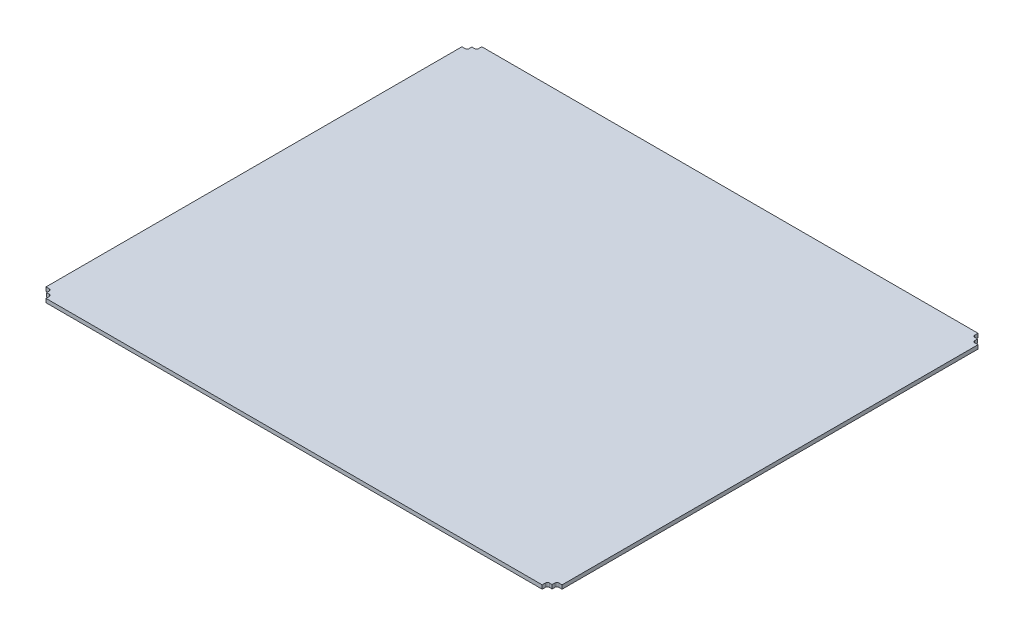
ISO-10303-21;
HEADER;
FILE_DESCRIPTION(('STEP AP214'),'2;1');
FILE_NAME('part.step','',(''),(''),'','','');
FILE_SCHEMA(('AUTOMOTIVE_DESIGN { 1 0 10303 214 1 1 1 1 }'));
ENDSEC;
DATA;
#1=APPLICATION_CONTEXT('core data for automotive mechanical design processes');
#2=APPLICATION_PROTOCOL_DEFINITION('international standard','automotive_design',2000,#1);
#3=PRODUCT_CONTEXT('',#1,'mechanical');
#4=PRODUCT('Part','Part','',(#3));
#5=PRODUCT_RELATED_PRODUCT_CATEGORY('part','',(#4));
#6=PRODUCT_DEFINITION_FORMATION('','',#4);
#7=PRODUCT_DEFINITION_CONTEXT('part definition',#1,'design');
#8=PRODUCT_DEFINITION('design','',#6,#7);
#9=PRODUCT_DEFINITION_SHAPE('','',#8);
#10=(LENGTH_UNIT() NAMED_UNIT(*) SI_UNIT(.MILLI.,.METRE.));
#11=(NAMED_UNIT(*) PLANE_ANGLE_UNIT() SI_UNIT($,.RADIAN.));
#12=(NAMED_UNIT(*) SI_UNIT($,.STERADIAN.) SOLID_ANGLE_UNIT());
#13=UNCERTAINTY_MEASURE_WITH_UNIT(LENGTH_MEASURE(1.E-05),#10,'distance_accuracy_value','');
#14=(GEOMETRIC_REPRESENTATION_CONTEXT(3) GLOBAL_UNCERTAINTY_ASSIGNED_CONTEXT((#13)) GLOBAL_UNIT_ASSIGNED_CONTEXT((#10,
#11,#12)) REPRESENTATION_CONTEXT('',''));
#15=CARTESIAN_POINT('',(0.,0.,0.));
#16=DIRECTION('',(0.,0.,1.));
#17=DIRECTION('',(1.,0.,0.));
#18=AXIS2_PLACEMENT_3D('',#15,#16,#17);
#19=CARTESIAN_POINT('',(428.625,3.175,-361.95));
#20=DIRECTION('',(0.,-1.,0.));
#21=DIRECTION('',(0.,0.,-1.));
#22=AXIS2_PLACEMENT_3D('',#19,#20,#21);
#23=PLANE('',#22);
#24=DIRECTION('',(1.,0.,0.));
#25=VECTOR('',#24,1.);
#26=CARTESIAN_POINT('',(-428.625,3.175,345.44));
#27=LINE('',#26,#25);
#28=CARTESIAN_POINT('',(-428.625,3.175,345.44));
#29=VERTEX_POINT('',#28);
#30=CARTESIAN_POINT('',(-423.164,3.175,345.44));
#31=VERTEX_POINT('',#30);
#32=EDGE_CURVE('E245',#29,#31,#27,.T.);
#33=ORIENTED_EDGE('',*,*,#32,.T.);
#34=CARTESIAN_POINT('',(-423.164,3.175,348.615));
#35=DIRECTION('',(0.,-1.,0.));
#36=DIRECTION('',(0.,0.,-1.));
#37=AXIS2_PLACEMENT_3D('',#34,#35,#36);
#38=CIRCLE('',#37,3.17499999999998);
#39=CARTESIAN_POINT('',(-419.989,3.175,348.615));
#40=VERTEX_POINT('',#39);
#41=EDGE_CURVE('E248',#31,#40,#38,.T.);
#42=ORIENTED_EDGE('',*,*,#41,.T.);
#43=DIRECTION('',(0.,0.,1.));
#44=VECTOR('',#43,1.);
#45=CARTESIAN_POINT('',(-419.989,3.175,353.314));
#46=LINE('',#45,#44);
#47=CARTESIAN_POINT('',(-419.989,3.175,353.314));
#48=VERTEX_POINT('',#47);
#49=EDGE_CURVE('E264',#40,#48,#46,.T.);
#50=ORIENTED_EDGE('',*,*,#49,.T.);
#51=DIRECTION('',(1.,0.,0.));
#52=VECTOR('',#51,1.);
#53=CARTESIAN_POINT('',(-419.989,3.175,353.314));
#54=LINE('',#53,#52);
#55=CARTESIAN_POINT('',(-415.29,3.175,353.314));
#56=VERTEX_POINT('',#55);
#57=EDGE_CURVE('E261',#48,#56,#54,.T.);
#58=ORIENTED_EDGE('',*,*,#57,.T.);
#59=CARTESIAN_POINT('',(-415.29,3.175,356.489));
#60=DIRECTION('',(0.,-1.,0.));
#61=DIRECTION('',(0.,0.,-1.));
#62=AXIS2_PLACEMENT_3D('',#59,#60,#61);
#63=CIRCLE('',#62,3.17499999999998);
#64=CARTESIAN_POINT('',(-412.115,3.175,356.489));
#65=VERTEX_POINT('',#64);
#66=EDGE_CURVE('E259',#56,#65,#63,.T.);
#67=ORIENTED_EDGE('',*,*,#66,.T.);
#68=DIRECTION('',(0.,0.,1.));
#69=VECTOR('',#68,1.);
#70=CARTESIAN_POINT('',(-412.115,3.175,361.95));
#71=LINE('',#70,#69);
#72=CARTESIAN_POINT('',(-412.115,3.175,361.95));
#73=VERTEX_POINT('',#72);
#74=EDGE_CURVE('E237',#65,#73,#71,.T.);
#75=ORIENTED_EDGE('',*,*,#74,.T.);
#76=DIRECTION('',(1.,0.,0.));
#77=VECTOR('',#76,1.);
#78=CARTESIAN_POINT('',(-428.625,3.175,361.95));
#79=LINE('',#78,#77);
#80=CARTESIAN_POINT('',(412.115,3.175,361.95));
#81=VERTEX_POINT('',#80);
#82=EDGE_CURVE('E11',#73,#81,#79,.T.);
#83=ORIENTED_EDGE('',*,*,#82,.T.);
#84=DIRECTION('',(0.,0.,1.));
#85=VECTOR('',#84,1.);
#86=CARTESIAN_POINT('',(412.115,3.175,361.95));
#87=LINE('',#86,#85);
#88=CARTESIAN_POINT('',(412.115,3.175,356.489));
#89=VERTEX_POINT('',#88);
#90=EDGE_CURVE('E285',#89,#81,#87,.T.);
#91=ORIENTED_EDGE('',*,*,#90,.F.);
#92=CARTESIAN_POINT('',(415.29,3.175,356.489));
#93=DIRECTION('',(0.,1.,0.));
#94=DIRECTION('',(0.,0.,-1.));
#95=AXIS2_PLACEMENT_3D('',#92,#93,#94);
#96=CIRCLE('',#95,3.17499999999998);
#97=CARTESIAN_POINT('',(415.29,3.175,353.314));
#98=VERTEX_POINT('',#97);
#99=EDGE_CURVE('E311',#98,#89,#96,.T.);
#100=ORIENTED_EDGE('',*,*,#99,.F.);
#101=DIRECTION('',(-1.,0.,0.));
#102=VECTOR('',#101,1.);
#103=CARTESIAN_POINT('',(419.989,3.175,353.314));
#104=LINE('',#103,#102);
#105=CARTESIAN_POINT('',(419.989,3.175,353.314));
#106=VERTEX_POINT('',#105);
#107=EDGE_CURVE('E308',#106,#98,#104,.T.);
#108=ORIENTED_EDGE('',*,*,#107,.F.);
#109=DIRECTION('',(0.,0.,1.));
#110=VECTOR('',#109,1.);
#111=CARTESIAN_POINT('',(419.989,3.175,353.314));
#112=LINE('',#111,#110);
#113=CARTESIAN_POINT('',(419.989,3.175,348.615));
#114=VERTEX_POINT('',#113);
#115=EDGE_CURVE('E305',#114,#106,#112,.T.);
#116=ORIENTED_EDGE('',*,*,#115,.F.);
#117=CARTESIAN_POINT('',(423.164,3.175,348.615));
#118=DIRECTION('',(0.,1.,0.));
#119=DIRECTION('',(0.,0.,-1.));
#120=AXIS2_PLACEMENT_3D('',#117,#118,#119);
#121=CIRCLE('',#120,3.17499999999998);
#122=CARTESIAN_POINT('',(423.164,3.175,345.44));
#123=VERTEX_POINT('',#122);
#124=EDGE_CURVE('E302',#123,#114,#121,.T.);
#125=ORIENTED_EDGE('',*,*,#124,.F.);
#126=DIRECTION('',(-1.,0.,0.));
#127=VECTOR('',#126,1.);
#128=CARTESIAN_POINT('',(428.625,3.175,345.44));
#129=LINE('',#128,#127);
#130=CARTESIAN_POINT('',(428.625,3.175,345.44));
#131=VERTEX_POINT('',#130);
#132=EDGE_CURVE('E272',#131,#123,#129,.T.);
#133=ORIENTED_EDGE('',*,*,#132,.F.);
#134=DIRECTION('',(0.,0.,-1.));
#135=VECTOR('',#134,1.);
#136=CARTESIAN_POINT('',(428.625,3.175,361.95));
#137=LINE('',#136,#135);
#138=CARTESIAN_POINT('',(428.625,3.175,-345.44));
#139=VERTEX_POINT('',#138);
#140=EDGE_CURVE('E427',#131,#139,#137,.T.);
#141=ORIENTED_EDGE('',*,*,#140,.T.);
#142=DIRECTION('',(-1.,0.,0.));
#143=VECTOR('',#142,1.);
#144=CARTESIAN_POINT('',(428.625,3.175,-345.44));
#145=LINE('',#144,#143);
#146=CARTESIAN_POINT('',(423.164,3.175,-345.44));
#147=VERTEX_POINT('',#146);
#148=EDGE_CURVE('E333',#139,#147,#145,.T.);
#149=ORIENTED_EDGE('',*,*,#148,.T.);
#150=CARTESIAN_POINT('',(423.164,3.175,-348.615));
#151=DIRECTION('',(0.,-1.,0.));
#152=DIRECTION('',(0.,0.,1.));
#153=AXIS2_PLACEMENT_3D('',#150,#151,#152);
#154=CIRCLE('',#153,3.17499999999998);
#155=CARTESIAN_POINT('',(419.989,3.175,-348.615));
#156=VERTEX_POINT('',#155);
#157=EDGE_CURVE('E356',#147,#156,#154,.T.);
#158=ORIENTED_EDGE('',*,*,#157,.T.);
#159=DIRECTION('',(0.,0.,-1.));
#160=VECTOR('',#159,1.);
#161=CARTESIAN_POINT('',(419.989,3.175,-353.314));
#162=LINE('',#161,#160);
#163=CARTESIAN_POINT('',(419.989,3.175,-353.314));
#164=VERTEX_POINT('',#163);
#165=EDGE_CURVE('E353',#156,#164,#162,.T.);
#166=ORIENTED_EDGE('',*,*,#165,.T.);
#167=DIRECTION('',(-1.,0.,0.));
#168=VECTOR('',#167,1.);
#169=CARTESIAN_POINT('',(419.989,3.175,-353.314));
#170=LINE('',#169,#168);
#171=CARTESIAN_POINT('',(415.29,3.175,-353.314));
#172=VERTEX_POINT('',#171);
#173=EDGE_CURVE('E350',#164,#172,#170,.T.);
#174=ORIENTED_EDGE('',*,*,#173,.T.);
#175=CARTESIAN_POINT('',(415.29,3.175,-356.489));
#176=DIRECTION('',(0.,-1.,0.));
#177=DIRECTION('',(0.,0.,1.));
#178=AXIS2_PLACEMENT_3D('',#175,#176,#177);
#179=CIRCLE('',#178,3.17499999999998);
#180=CARTESIAN_POINT('',(412.115,3.175,-356.489));
#181=VERTEX_POINT('',#180);
#182=EDGE_CURVE('E347',#172,#181,#179,.T.);
#183=ORIENTED_EDGE('',*,*,#182,.T.);
#184=DIRECTION('',(0.,0.,-1.));
#185=VECTOR('',#184,1.);
#186=CARTESIAN_POINT('',(412.115,3.175,-361.95));
#187=LINE('',#186,#185);
#188=CARTESIAN_POINT('',(412.115,3.175,-361.95));
#189=VERTEX_POINT('',#188);
#190=EDGE_CURVE('E318',#181,#189,#187,.T.);
#191=ORIENTED_EDGE('',*,*,#190,.T.);
#192=DIRECTION('',(-1.,0.,0.));
#193=VECTOR('',#192,1.);
#194=CARTESIAN_POINT('',(-428.625,3.175,-361.95));
#195=LINE('',#194,#193);
#196=CARTESIAN_POINT('',(-412.115,3.175,-361.95));
#197=VERTEX_POINT('',#196);
#198=EDGE_CURVE('E430',#189,#197,#195,.T.);
#199=ORIENTED_EDGE('',*,*,#198,.T.);
#200=DIRECTION('',(0.,0.,-1.));
#201=VECTOR('',#200,1.);
#202=CARTESIAN_POINT('',(-412.115,3.175,-361.95));
#203=LINE('',#202,#201);
#204=CARTESIAN_POINT('',(-412.115,3.175,-356.489));
#205=VERTEX_POINT('',#204);
#206=EDGE_CURVE('E380',#205,#197,#203,.T.);
#207=ORIENTED_EDGE('',*,*,#206,.F.);
#208=CARTESIAN_POINT('',(-415.29,3.175,-356.489));
#209=DIRECTION('',(0.,1.,0.));
#210=DIRECTION('',(0.,0.,1.));
#211=AXIS2_PLACEMENT_3D('',#208,#209,#210);
#212=CIRCLE('',#211,3.17499999999998);
#213=CARTESIAN_POINT('',(-415.29,3.175,-353.314));
#214=VERTEX_POINT('',#213);
#215=EDGE_CURVE('E407',#214,#205,#212,.T.);
#216=ORIENTED_EDGE('',*,*,#215,.F.);
#217=DIRECTION('',(1.,0.,0.));
#218=VECTOR('',#217,1.);
#219=CARTESIAN_POINT('',(-419.989,3.175,-353.314));
#220=LINE('',#219,#218);
#221=CARTESIAN_POINT('',(-419.989,3.175,-353.314));
#222=VERTEX_POINT('',#221);
#223=EDGE_CURVE('E404',#222,#214,#220,.T.);
#224=ORIENTED_EDGE('',*,*,#223,.F.);
#225=DIRECTION('',(0.,0.,-1.));
#226=VECTOR('',#225,1.);
#227=CARTESIAN_POINT('',(-419.989,3.175,-353.314));
#228=LINE('',#227,#226);
#229=CARTESIAN_POINT('',(-419.989,3.175,-348.615));
#230=VERTEX_POINT('',#229);
#231=EDGE_CURVE('E401',#230,#222,#228,.T.);
#232=ORIENTED_EDGE('',*,*,#231,.F.);
#233=CARTESIAN_POINT('',(-423.164,3.175,-348.615));
#234=DIRECTION('',(0.,1.,0.));
#235=DIRECTION('',(0.,0.,1.));
#236=AXIS2_PLACEMENT_3D('',#233,#234,#235);
#237=CIRCLE('',#236,3.17499999999998);
#238=CARTESIAN_POINT('',(-423.164,3.175,-345.44));
#239=VERTEX_POINT('',#238);
#240=EDGE_CURVE('E398',#239,#230,#237,.T.);
#241=ORIENTED_EDGE('',*,*,#240,.F.);
#242=DIRECTION('',(1.,0.,0.));
#243=VECTOR('',#242,1.);
#244=CARTESIAN_POINT('',(-428.625,3.175,-345.44));
#245=LINE('',#244,#243);
#246=CARTESIAN_POINT('',(-428.625,3.175,-345.44));
#247=VERTEX_POINT('',#246);
#248=EDGE_CURVE('E364',#247,#239,#245,.T.);
#249=ORIENTED_EDGE('',*,*,#248,.F.);
#250=DIRECTION('',(0.,0.,1.));
#251=VECTOR('',#250,1.);
#252=CARTESIAN_POINT('',(-428.625,3.175,361.95));
#253=LINE('',#252,#251);
#254=EDGE_CURVE('E47',#247,#29,#253,.T.);
#255=ORIENTED_EDGE('',*,*,#254,.T.);
#256=EDGE_LOOP('',(#33,#42,#50,#58,#67,#75,#83,#91,#100,#108,#116,#125,#133,#141,#149,#158,#166,
#174,#183,#191,#199,#207,#216,#224,#232,#241,#249,#255));
#257=FACE_BOUND('',#256,.T.);
#258=ADVANCED_FACE('F38',(#257),#23,.F.);
#259=CARTESIAN_POINT('',(428.625,-3.175,-361.95));
#260=DIRECTION('',(0.,-1.,0.));
#261=DIRECTION('',(0.,0.,-1.));
#262=AXIS2_PLACEMENT_3D('',#259,#260,#261);
#263=PLANE('',#262);
#264=CARTESIAN_POINT('',(-423.164,-3.175,348.615));
#265=DIRECTION('',(0.,-1.,0.));
#266=DIRECTION('',(0.,0.,-1.));
#267=AXIS2_PLACEMENT_3D('',#264,#265,#266);
#268=CIRCLE('',#267,3.17499999999998);
#269=CARTESIAN_POINT('',(-423.164,-3.175,345.44));
#270=VERTEX_POINT('',#269);
#271=CARTESIAN_POINT('',(-419.989,-3.175,348.615));
#272=VERTEX_POINT('',#271);
#273=EDGE_CURVE('E254',#270,#272,#268,.T.);
#274=ORIENTED_EDGE('',*,*,#273,.F.);
#275=DIRECTION('',(1.,0.,0.));
#276=VECTOR('',#275,1.);
#277=CARTESIAN_POINT('',(-428.625,-3.175,345.44));
#278=LINE('',#277,#276);
#279=CARTESIAN_POINT('',(-428.625,-3.175,345.44));
#280=VERTEX_POINT('',#279);
#281=EDGE_CURVE('E256',#280,#270,#278,.T.);
#282=ORIENTED_EDGE('',*,*,#281,.F.);
#283=DIRECTION('',(0.,0.,1.));
#284=VECTOR('',#283,1.);
#285=CARTESIAN_POINT('',(-428.625,-3.175,361.95));
#286=LINE('',#285,#284);
#287=CARTESIAN_POINT('',(-428.625,-3.175,-345.44));
#288=VERTEX_POINT('',#287);
#289=EDGE_CURVE('E438',#288,#280,#286,.T.);
#290=ORIENTED_EDGE('',*,*,#289,.F.);
#291=DIRECTION('',(1.,0.,0.));
#292=VECTOR('',#291,1.);
#293=CARTESIAN_POINT('',(-428.625,-3.175,-345.44));
#294=LINE('',#293,#292);
#295=CARTESIAN_POINT('',(-423.164,-3.175,-345.44));
#296=VERTEX_POINT('',#295);
#297=EDGE_CURVE('E376',#288,#296,#294,.T.);
#298=ORIENTED_EDGE('',*,*,#297,.T.);
#299=CARTESIAN_POINT('',(-423.164,-3.175,-348.615));
#300=DIRECTION('',(0.,1.,0.));
#301=DIRECTION('',(0.,0.,1.));
#302=AXIS2_PLACEMENT_3D('',#299,#300,#301);
#303=CIRCLE('',#302,3.17499999999998);
#304=CARTESIAN_POINT('',(-419.989,-3.175,-348.615));
#305=VERTEX_POINT('',#304);
#306=EDGE_CURVE('E379',#296,#305,#303,.T.);
#307=ORIENTED_EDGE('',*,*,#306,.T.);
#308=DIRECTION('',(0.,0.,-1.));
#309=VECTOR('',#308,1.);
#310=CARTESIAN_POINT('',(-419.989,-3.175,-353.314));
#311=LINE('',#310,#309);
#312=CARTESIAN_POINT('',(-419.989,-3.175,-353.314));
#313=VERTEX_POINT('',#312);
#314=EDGE_CURVE('E383',#305,#313,#311,.T.);
#315=ORIENTED_EDGE('',*,*,#314,.T.);
#316=DIRECTION('',(1.,0.,0.));
#317=VECTOR('',#316,1.);
#318=CARTESIAN_POINT('',(-419.989,-3.175,-353.314));
#319=LINE('',#318,#317);
#320=CARTESIAN_POINT('',(-415.29,-3.175,-353.314));
#321=VERTEX_POINT('',#320);
#322=EDGE_CURVE('E386',#313,#321,#319,.T.);
#323=ORIENTED_EDGE('',*,*,#322,.T.);
#324=CARTESIAN_POINT('',(-415.29,-3.175,-356.489));
#325=DIRECTION('',(0.,1.,0.));
#326=DIRECTION('',(0.,0.,1.));
#327=AXIS2_PLACEMENT_3D('',#324,#325,#326);
#328=CIRCLE('',#327,3.17499999999998);
#329=CARTESIAN_POINT('',(-412.115,-3.175,-356.489));
#330=VERTEX_POINT('',#329);
#331=EDGE_CURVE('E389',#321,#330,#328,.T.);
#332=ORIENTED_EDGE('',*,*,#331,.T.);
#333=DIRECTION('',(0.,0.,-1.));
#334=VECTOR('',#333,1.);
#335=CARTESIAN_POINT('',(-412.115,-3.175,-361.95));
#336=LINE('',#335,#334);
#337=CARTESIAN_POINT('',(-412.115,-3.175,-361.95));
#338=VERTEX_POINT('',#337);
#339=EDGE_CURVE('E392',#330,#338,#336,.T.);
#340=ORIENTED_EDGE('',*,*,#339,.T.);
#341=DIRECTION('',(-1.,0.,0.));
#342=VECTOR('',#341,1.);
#343=CARTESIAN_POINT('',(-428.625,-3.175,-361.95));
#344=LINE('',#343,#342);
#345=CARTESIAN_POINT('',(412.115,-3.175,-361.95));
#346=VERTEX_POINT('',#345);
#347=EDGE_CURVE('E437',#346,#338,#344,.T.);
#348=ORIENTED_EDGE('',*,*,#347,.F.);
#349=DIRECTION('',(0.,0.,-1.));
#350=VECTOR('',#349,1.);
#351=CARTESIAN_POINT('',(412.115,-3.175,-361.95));
#352=LINE('',#351,#350);
#353=CARTESIAN_POINT('',(412.115,-3.175,-356.489));
#354=VERTEX_POINT('',#353);
#355=EDGE_CURVE('E330',#354,#346,#352,.T.);
#356=ORIENTED_EDGE('',*,*,#355,.F.);
#357=CARTESIAN_POINT('',(415.29,-3.175,-356.489));
#358=DIRECTION('',(0.,-1.,0.));
#359=DIRECTION('',(0.,0.,1.));
#360=AXIS2_PLACEMENT_3D('',#357,#358,#359);
#361=CIRCLE('',#360,3.17499999999998);
#362=CARTESIAN_POINT('',(415.29,-3.175,-353.314));
#363=VERTEX_POINT('',#362);
#364=EDGE_CURVE('E332',#363,#354,#361,.T.);
#365=ORIENTED_EDGE('',*,*,#364,.F.);
#366=DIRECTION('',(-1.,0.,0.));
#367=VECTOR('',#366,1.);
#368=CARTESIAN_POINT('',(419.989,-3.175,-353.314));
#369=LINE('',#368,#367);
#370=CARTESIAN_POINT('',(419.989,-3.175,-353.314));
#371=VERTEX_POINT('',#370);
#372=EDGE_CURVE('E336',#371,#363,#369,.T.);
#373=ORIENTED_EDGE('',*,*,#372,.F.);
#374=DIRECTION('',(0.,0.,-1.));
#375=VECTOR('',#374,1.);
#376=CARTESIAN_POINT('',(419.989,-3.175,-353.314));
#377=LINE('',#376,#375);
#378=CARTESIAN_POINT('',(419.989,-3.175,-348.615));
#379=VERTEX_POINT('',#378);
#380=EDGE_CURVE('E338',#379,#371,#377,.T.);
#381=ORIENTED_EDGE('',*,*,#380,.F.);
#382=CARTESIAN_POINT('',(423.164,-3.175,-348.615));
#383=DIRECTION('',(0.,-1.,0.));
#384=DIRECTION('',(0.,0.,1.));
#385=AXIS2_PLACEMENT_3D('',#382,#383,#384);
#386=CIRCLE('',#385,3.17499999999998);
#387=CARTESIAN_POINT('',(423.164,-3.175,-345.44));
#388=VERTEX_POINT('',#387);
#389=EDGE_CURVE('E340',#388,#379,#386,.T.);
#390=ORIENTED_EDGE('',*,*,#389,.F.);
#391=DIRECTION('',(-1.,0.,0.));
#392=VECTOR('',#391,1.);
#393=CARTESIAN_POINT('',(428.625,-3.175,-345.44));
#394=LINE('',#393,#392);
#395=CARTESIAN_POINT('',(428.625,-3.175,-345.44));
#396=VERTEX_POINT('',#395);
#397=EDGE_CURVE('E342',#396,#388,#394,.T.);
#398=ORIENTED_EDGE('',*,*,#397,.F.);
#399=DIRECTION('',(0.,0.,-1.));
#400=VECTOR('',#399,1.);
#401=CARTESIAN_POINT('',(428.625,-3.175,361.95));
#402=LINE('',#401,#400);
#403=CARTESIAN_POINT('',(428.625,-3.175,345.44));
#404=VERTEX_POINT('',#403);
#405=EDGE_CURVE('E415',#404,#396,#402,.T.);
#406=ORIENTED_EDGE('',*,*,#405,.F.);
#407=DIRECTION('',(-1.,0.,0.));
#408=VECTOR('',#407,1.);
#409=CARTESIAN_POINT('',(428.625,-3.175,345.44));
#410=LINE('',#409,#408);
#411=CARTESIAN_POINT('',(423.164,-3.175,345.44));
#412=VERTEX_POINT('',#411);
#413=EDGE_CURVE('E281',#404,#412,#410,.T.);
#414=ORIENTED_EDGE('',*,*,#413,.T.);
#415=CARTESIAN_POINT('',(423.164,-3.175,348.615));
#416=DIRECTION('',(0.,1.,0.));
#417=DIRECTION('',(0.,0.,-1.));
#418=AXIS2_PLACEMENT_3D('',#415,#416,#417);
#419=CIRCLE('',#418,3.17499999999998);
#420=CARTESIAN_POINT('',(419.989,-3.175,348.615));
#421=VERTEX_POINT('',#420);
#422=EDGE_CURVE('E284',#412,#421,#419,.T.);
#423=ORIENTED_EDGE('',*,*,#422,.T.);
#424=DIRECTION('',(0.,0.,1.));
#425=VECTOR('',#424,1.);
#426=CARTESIAN_POINT('',(419.989,-3.175,353.314));
#427=LINE('',#426,#425);
#428=CARTESIAN_POINT('',(419.989,-3.175,353.314));
#429=VERTEX_POINT('',#428);
#430=EDGE_CURVE('E288',#421,#429,#427,.T.);
#431=ORIENTED_EDGE('',*,*,#430,.T.);
#432=DIRECTION('',(-1.,0.,0.));
#433=VECTOR('',#432,1.);
#434=CARTESIAN_POINT('',(419.989,-3.175,353.314));
#435=LINE('',#434,#433);
#436=CARTESIAN_POINT('',(415.29,-3.175,353.314));
#437=VERTEX_POINT('',#436);
#438=EDGE_CURVE('E291',#429,#437,#435,.T.);
#439=ORIENTED_EDGE('',*,*,#438,.T.);
#440=CARTESIAN_POINT('',(415.29,-3.175,356.489));
#441=DIRECTION('',(0.,1.,0.));
#442=DIRECTION('',(0.,0.,-1.));
#443=AXIS2_PLACEMENT_3D('',#440,#441,#442);
#444=CIRCLE('',#443,3.17499999999998);
#445=CARTESIAN_POINT('',(412.115,-3.175,356.489));
#446=VERTEX_POINT('',#445);
#447=EDGE_CURVE('E294',#437,#446,#444,.T.);
#448=ORIENTED_EDGE('',*,*,#447,.T.);
#449=DIRECTION('',(0.,0.,1.));
#450=VECTOR('',#449,1.);
#451=CARTESIAN_POINT('',(412.115,-3.175,361.95));
#452=LINE('',#451,#450);
#453=CARTESIAN_POINT('',(412.115,-3.175,361.95));
#454=VERTEX_POINT('',#453);
#455=EDGE_CURVE('E297',#446,#454,#452,.T.);
#456=ORIENTED_EDGE('',*,*,#455,.T.);
#457=DIRECTION('',(1.,0.,0.));
#458=VECTOR('',#457,1.);
#459=CARTESIAN_POINT('',(-428.625,-3.175,361.95));
#460=LINE('',#459,#458);
#461=CARTESIAN_POINT('',(-412.115,-3.175,361.95));
#462=VERTEX_POINT('',#461);
#463=EDGE_CURVE('E42',#462,#454,#460,.T.);
#464=ORIENTED_EDGE('',*,*,#463,.F.);
#465=DIRECTION('',(0.,0.,1.));
#466=VECTOR('',#465,1.);
#467=CARTESIAN_POINT('',(-412.115,-3.175,361.95));
#468=LINE('',#467,#466);
#469=CARTESIAN_POINT('',(-412.115,-3.175,356.489));
#470=VERTEX_POINT('',#469);
#471=EDGE_CURVE('E55',#470,#462,#468,.T.);
#472=ORIENTED_EDGE('',*,*,#471,.F.);
#473=CARTESIAN_POINT('',(-415.29,-3.175,356.489));
#474=DIRECTION('',(0.,-1.,0.));
#475=DIRECTION('',(0.,0.,-1.));
#476=AXIS2_PLACEMENT_3D('',#473,#474,#475);
#477=CIRCLE('',#476,3.17499999999998);
#478=CARTESIAN_POINT('',(-415.29,-3.175,353.314));
#479=VERTEX_POINT('',#478);
#480=EDGE_CURVE('E226',#479,#470,#477,.T.);
#481=ORIENTED_EDGE('',*,*,#480,.F.);
#482=DIRECTION('',(1.,0.,0.));
#483=VECTOR('',#482,1.);
#484=CARTESIAN_POINT('',(-419.989,-3.175,353.314));
#485=LINE('',#484,#483);
#486=CARTESIAN_POINT('',(-419.989,-3.175,353.314));
#487=VERTEX_POINT('',#486);
#488=EDGE_CURVE('E234',#487,#479,#485,.T.);
#489=ORIENTED_EDGE('',*,*,#488,.F.);
#490=DIRECTION('',(0.,0.,1.));
#491=VECTOR('',#490,1.);
#492=CARTESIAN_POINT('',(-419.989,-3.175,353.314));
#493=LINE('',#492,#491);
#494=EDGE_CURVE('E252',#272,#487,#493,.T.);
#495=ORIENTED_EDGE('',*,*,#494,.F.);
#496=EDGE_LOOP('',(#274,#282,#290,#298,#307,#315,#323,#332,#340,#348,#356,#365,#373,#381,#390,
#398,#406,#414,#423,#431,#439,#448,#456,#464,#472,#481,#489,#495));
#497=FACE_BOUND('',#496,.T.);
#498=ADVANCED_FACE('F243',(#497),#263,.T.);
#499=CARTESIAN_POINT('',(-428.625,3.175,361.95));
#500=DIRECTION('',(1.,0.,0.));
#501=DIRECTION('',(0.,0.,-1.));
#502=AXIS2_PLACEMENT_3D('',#499,#500,#501);
#503=PLANE('',#502);
#504=DIRECTION('',(0.,1.,0.));
#505=VECTOR('',#504,1.);
#506=CARTESIAN_POINT('',(-428.625,-3.175,345.44));
#507=LINE('',#506,#505);
#508=EDGE_CURVE('E269',#280,#29,#507,.T.);
#509=ORIENTED_EDGE('',*,*,#508,.T.);
#510=ORIENTED_EDGE('',*,*,#254,.F.);
#511=DIRECTION('',(0.,1.,0.));
#512=VECTOR('',#511,1.);
#513=CARTESIAN_POINT('',(-428.625,-3.175,-345.44));
#514=LINE('',#513,#512);
#515=EDGE_CURVE('E395',#288,#247,#514,.T.);
#516=ORIENTED_EDGE('',*,*,#515,.F.);
#517=ORIENTED_EDGE('',*,*,#289,.T.);
#518=EDGE_LOOP('',(#509,#510,#516,#517));
#519=FACE_BOUND('',#518,.T.);
#520=ADVANCED_FACE('F461',(#519),#503,.F.);
#521=CARTESIAN_POINT('',(-428.625,3.175,361.95));
#522=DIRECTION('',(0.,0.,-1.));
#523=DIRECTION('',(-1.,0.,0.));
#524=AXIS2_PLACEMENT_3D('',#521,#522,#523);
#525=PLANE('',#524);
#526=DIRECTION('',(0.,1.,0.));
#527=VECTOR('',#526,1.);
#528=CARTESIAN_POINT('',(-412.115,-3.175,361.95));
#529=LINE('',#528,#527);
#530=EDGE_CURVE('E239',#462,#73,#529,.T.);
#531=ORIENTED_EDGE('',*,*,#530,.F.);
#532=ORIENTED_EDGE('',*,*,#463,.T.);
#533=DIRECTION('',(0.,1.,0.));
#534=VECTOR('',#533,1.);
#535=CARTESIAN_POINT('',(412.115,-3.175,361.95));
#536=LINE('',#535,#534);
#537=EDGE_CURVE('E315',#454,#81,#536,.T.);
#538=ORIENTED_EDGE('',*,*,#537,.T.);
#539=ORIENTED_EDGE('',*,*,#82,.F.);
#540=EDGE_LOOP('',(#531,#532,#538,#539));
#541=FACE_BOUND('',#540,.T.);
#542=ADVANCED_FACE('F446',(#541),#525,.F.);
#543=CARTESIAN_POINT('',(428.625,3.175,361.95));
#544=DIRECTION('',(-1.,0.,0.));
#545=DIRECTION('',(0.,0.,1.));
#546=AXIS2_PLACEMENT_3D('',#543,#544,#545);
#547=PLANE('',#546);
#548=ORIENTED_EDGE('',*,*,#140,.F.);
#549=DIRECTION('',(0.,1.,0.));
#550=VECTOR('',#549,1.);
#551=CARTESIAN_POINT('',(428.625,-3.175,345.44));
#552=LINE('',#551,#550);
#553=EDGE_CURVE('E299',#404,#131,#552,.T.);
#554=ORIENTED_EDGE('',*,*,#553,.F.);
#555=ORIENTED_EDGE('',*,*,#405,.T.);
#556=DIRECTION('',(0.,1.,0.));
#557=VECTOR('',#556,1.);
#558=CARTESIAN_POINT('',(428.625,-3.175,-345.44));
#559=LINE('',#558,#557);
#560=EDGE_CURVE('E361',#396,#139,#559,.T.);
#561=ORIENTED_EDGE('',*,*,#560,.T.);
#562=EDGE_LOOP('',(#548,#554,#555,#561));
#563=FACE_BOUND('',#562,.T.);
#564=ADVANCED_FACE('F40',(#563),#547,.F.);
#565=CARTESIAN_POINT('',(-428.625,3.175,-361.95));
#566=DIRECTION('',(0.,0.,1.));
#567=DIRECTION('',(1.,0.,0.));
#568=AXIS2_PLACEMENT_3D('',#565,#566,#567);
#569=PLANE('',#568);
#570=DIRECTION('',(0.,1.,0.));
#571=VECTOR('',#570,1.);
#572=CARTESIAN_POINT('',(412.115,-3.175,-361.95));
#573=LINE('',#572,#571);
#574=EDGE_CURVE('E344',#346,#189,#573,.T.);
#575=ORIENTED_EDGE('',*,*,#574,.F.);
#576=ORIENTED_EDGE('',*,*,#347,.T.);
#577=DIRECTION('',(0.,1.,0.));
#578=VECTOR('',#577,1.);
#579=CARTESIAN_POINT('',(-412.115,-3.175,-361.95));
#580=LINE('',#579,#578);
#581=EDGE_CURVE('E412',#338,#197,#580,.T.);
#582=ORIENTED_EDGE('',*,*,#581,.T.);
#583=ORIENTED_EDGE('',*,*,#198,.F.);
#584=EDGE_LOOP('',(#575,#576,#582,#583));
#585=FACE_BOUND('',#584,.T.);
#586=ADVANCED_FACE('F470',(#585),#569,.F.);
#587=CARTESIAN_POINT('',(-412.115,-3.175,-361.95));
#588=DIRECTION('',(1.,0.,0.));
#589=DIRECTION('',(0.,0.,-1.));
#590=AXIS2_PLACEMENT_3D('',#587,#588,#589);
#591=PLANE('',#590);
#592=ORIENTED_EDGE('',*,*,#206,.T.);
#593=ORIENTED_EDGE('',*,*,#581,.F.);
#594=ORIENTED_EDGE('',*,*,#339,.F.);
#595=DIRECTION('',(0.,1.,0.));
#596=VECTOR('',#595,1.);
#597=CARTESIAN_POINT('',(-412.115,-3.175,-356.489));
#598=LINE('',#597,#596);
#599=EDGE_CURVE('E416',#330,#205,#598,.T.);
#600=ORIENTED_EDGE('',*,*,#599,.T.);
#601=EDGE_LOOP('',(#592,#593,#594,#600));
#602=FACE_BOUND('',#601,.T.);
#603=ADVANCED_FACE('F472',(#602),#591,.F.);
#604=CARTESIAN_POINT('',(-415.29,-3.175,-356.489));
#605=DIRECTION('',(0.,1.,0.));
#606=DIRECTION('',(0.,0.,1.));
#607=AXIS2_PLACEMENT_3D('',#604,#605,#606);
#608=CYLINDRICAL_SURFACE('',#607,3.17499999999998);
#609=ORIENTED_EDGE('',*,*,#215,.T.);
#610=ORIENTED_EDGE('',*,*,#599,.F.);
#611=ORIENTED_EDGE('',*,*,#331,.F.);
#612=DIRECTION('',(0.,1.,0.));
#613=VECTOR('',#612,1.);
#614=CARTESIAN_POINT('',(-415.29,-3.175,-353.314));
#615=LINE('',#614,#613);
#616=EDGE_CURVE('E418',#321,#214,#615,.T.);
#617=ORIENTED_EDGE('',*,*,#616,.T.);
#618=EDGE_LOOP('',(#609,#610,#611,#617));
#619=FACE_BOUND('',#618,.T.);
#620=ADVANCED_FACE('F478',(#619),#608,.F.);
#621=CARTESIAN_POINT('',(-419.989,-3.175,-353.314));
#622=DIRECTION('',(0.,0.,1.));
#623=DIRECTION('',(1.,0.,0.));
#624=AXIS2_PLACEMENT_3D('',#621,#622,#623);
#625=PLANE('',#624);
#626=ORIENTED_EDGE('',*,*,#223,.T.);
#627=ORIENTED_EDGE('',*,*,#616,.F.);
#628=ORIENTED_EDGE('',*,*,#322,.F.);
#629=DIRECTION('',(0.,1.,0.));
#630=VECTOR('',#629,1.);
#631=CARTESIAN_POINT('',(-419.989,-3.175,-353.314));
#632=LINE('',#631,#630);
#633=EDGE_CURVE('E420',#313,#222,#632,.T.);
#634=ORIENTED_EDGE('',*,*,#633,.T.);
#635=EDGE_LOOP('',(#626,#627,#628,#634));
#636=FACE_BOUND('',#635,.T.);
#637=ADVANCED_FACE('F565',(#636),#625,.F.);
#638=CARTESIAN_POINT('',(-419.989,-3.175,-353.314));
#639=DIRECTION('',(1.,0.,0.));
#640=DIRECTION('',(0.,0.,-1.));
#641=AXIS2_PLACEMENT_3D('',#638,#639,#640);
#642=PLANE('',#641);
#643=ORIENTED_EDGE('',*,*,#231,.T.);
#644=ORIENTED_EDGE('',*,*,#633,.F.);
#645=ORIENTED_EDGE('',*,*,#314,.F.);
#646=DIRECTION('',(0.,1.,0.));
#647=VECTOR('',#646,1.);
#648=CARTESIAN_POINT('',(-419.989,-3.175,-348.615));
#649=LINE('',#648,#647);
#650=EDGE_CURVE('E422',#305,#230,#649,.T.);
#651=ORIENTED_EDGE('',*,*,#650,.T.);
#652=EDGE_LOOP('',(#643,#644,#645,#651));
#653=FACE_BOUND('',#652,.T.);
#654=ADVANCED_FACE('F569',(#653),#642,.F.);
#655=CARTESIAN_POINT('',(-423.164,-3.175,-348.615));
#656=DIRECTION('',(0.,1.,0.));
#657=DIRECTION('',(0.,0.,1.));
#658=AXIS2_PLACEMENT_3D('',#655,#656,#657);
#659=CYLINDRICAL_SURFACE('',#658,3.17499999999998);
#660=ORIENTED_EDGE('',*,*,#240,.T.);
#661=ORIENTED_EDGE('',*,*,#650,.F.);
#662=ORIENTED_EDGE('',*,*,#306,.F.);
#663=DIRECTION('',(0.,1.,0.));
#664=VECTOR('',#663,1.);
#665=CARTESIAN_POINT('',(-423.164,-3.175,-345.44));
#666=LINE('',#665,#664);
#667=EDGE_CURVE('E424',#296,#239,#666,.T.);
#668=ORIENTED_EDGE('',*,*,#667,.T.);
#669=EDGE_LOOP('',(#660,#661,#662,#668));
#670=FACE_BOUND('',#669,.T.);
#671=ADVANCED_FACE('F572',(#670),#659,.F.);
#672=CARTESIAN_POINT('',(-428.625,-3.175,-345.44));
#673=DIRECTION('',(0.,0.,1.));
#674=DIRECTION('',(1.,0.,0.));
#675=AXIS2_PLACEMENT_3D('',#672,#673,#674);
#676=PLANE('',#675);
#677=ORIENTED_EDGE('',*,*,#248,.T.);
#678=ORIENTED_EDGE('',*,*,#667,.F.);
#679=ORIENTED_EDGE('',*,*,#297,.F.);
#680=ORIENTED_EDGE('',*,*,#515,.T.);
#681=EDGE_LOOP('',(#677,#678,#679,#680));
#682=FACE_BOUND('',#681,.T.);
#683=ADVANCED_FACE('F464',(#682),#676,.F.);
#684=CARTESIAN_POINT('',(428.625,-3.175,-345.44));
#685=DIRECTION('',(0.,0.,-1.));
#686=DIRECTION('',(-1.,0.,0.));
#687=AXIS2_PLACEMENT_3D('',#684,#685,#686);
#688=PLANE('',#687);
#689=ORIENTED_EDGE('',*,*,#148,.F.);
#690=ORIENTED_EDGE('',*,*,#560,.F.);
#691=ORIENTED_EDGE('',*,*,#397,.T.);
#692=DIRECTION('',(0.,1.,0.));
#693=VECTOR('',#692,1.);
#694=CARTESIAN_POINT('',(423.164,-3.175,-345.44));
#695=LINE('',#694,#693);
#696=EDGE_CURVE('E365',#388,#147,#695,.T.);
#697=ORIENTED_EDGE('',*,*,#696,.T.);
#698=EDGE_LOOP('',(#689,#690,#691,#697));
#699=FACE_BOUND('',#698,.T.);
#700=ADVANCED_FACE('F520',(#699),#688,.T.);
#701=CARTESIAN_POINT('',(423.164,-3.175,-348.615));
#702=DIRECTION('',(0.,1.,0.));
#703=DIRECTION('',(0.,0.,1.));
#704=AXIS2_PLACEMENT_3D('',#701,#702,#703);
#705=CYLINDRICAL_SURFACE('',#704,3.17499999999998);
#706=ORIENTED_EDGE('',*,*,#157,.F.);
#707=ORIENTED_EDGE('',*,*,#696,.F.);
#708=ORIENTED_EDGE('',*,*,#389,.T.);
#709=DIRECTION('',(0.,1.,0.));
#710=VECTOR('',#709,1.);
#711=CARTESIAN_POINT('',(419.989,-3.175,-348.615));
#712=LINE('',#711,#710);
#713=EDGE_CURVE('E367',#379,#156,#712,.T.);
#714=ORIENTED_EDGE('',*,*,#713,.T.);
#715=EDGE_LOOP('',(#706,#707,#708,#714));
#716=FACE_BOUND('',#715,.T.);
#717=ADVANCED_FACE('F513',(#716),#705,.F.);
#718=CARTESIAN_POINT('',(419.989,-3.175,-353.314));
#719=DIRECTION('',(1.,0.,0.));
#720=DIRECTION('',(0.,0.,-1.));
#721=AXIS2_PLACEMENT_3D('',#718,#719,#720);
#722=PLANE('',#721);
#723=ORIENTED_EDGE('',*,*,#165,.F.);
#724=ORIENTED_EDGE('',*,*,#713,.F.);
#725=ORIENTED_EDGE('',*,*,#380,.T.);
#726=DIRECTION('',(0.,1.,0.));
#727=VECTOR('',#726,1.);
#728=CARTESIAN_POINT('',(419.989,-3.175,-353.314));
#729=LINE('',#728,#727);
#730=EDGE_CURVE('E369',#371,#164,#729,.T.);
#731=ORIENTED_EDGE('',*,*,#730,.T.);
#732=EDGE_LOOP('',(#723,#724,#725,#731));
#733=FACE_BOUND('',#732,.T.);
#734=ADVANCED_FACE('F509',(#733),#722,.T.);
#735=CARTESIAN_POINT('',(419.989,-3.175,-353.314));
#736=DIRECTION('',(0.,0.,-1.));
#737=DIRECTION('',(-1.,0.,0.));
#738=AXIS2_PLACEMENT_3D('',#735,#736,#737);
#739=PLANE('',#738);
#740=ORIENTED_EDGE('',*,*,#173,.F.);
#741=ORIENTED_EDGE('',*,*,#730,.F.);
#742=ORIENTED_EDGE('',*,*,#372,.T.);
#743=DIRECTION('',(0.,1.,0.));
#744=VECTOR('',#743,1.);
#745=CARTESIAN_POINT('',(415.29,-3.175,-353.314));
#746=LINE('',#745,#744);
#747=EDGE_CURVE('E371',#363,#172,#746,.T.);
#748=ORIENTED_EDGE('',*,*,#747,.T.);
#749=EDGE_LOOP('',(#740,#741,#742,#748));
#750=FACE_BOUND('',#749,.T.);
#751=ADVANCED_FACE('F506',(#750),#739,.T.);
#752=CARTESIAN_POINT('',(415.29,-3.175,-356.489));
#753=DIRECTION('',(0.,1.,0.));
#754=DIRECTION('',(0.,0.,1.));
#755=AXIS2_PLACEMENT_3D('',#752,#753,#754);
#756=CYLINDRICAL_SURFACE('',#755,3.17499999999998);
#757=ORIENTED_EDGE('',*,*,#182,.F.);
#758=ORIENTED_EDGE('',*,*,#747,.F.);
#759=ORIENTED_EDGE('',*,*,#364,.T.);
#760=DIRECTION('',(0.,1.,0.));
#761=VECTOR('',#760,1.);
#762=CARTESIAN_POINT('',(412.115,-3.175,-356.489));
#763=LINE('',#762,#761);
#764=EDGE_CURVE('E373',#354,#181,#763,.T.);
#765=ORIENTED_EDGE('',*,*,#764,.T.);
#766=EDGE_LOOP('',(#757,#758,#759,#765));
#767=FACE_BOUND('',#766,.T.);
#768=ADVANCED_FACE('F499',(#767),#756,.F.);
#769=CARTESIAN_POINT('',(412.115,-3.175,-361.95));
#770=DIRECTION('',(1.,0.,0.));
#771=DIRECTION('',(0.,0.,-1.));
#772=AXIS2_PLACEMENT_3D('',#769,#770,#771);
#773=PLANE('',#772);
#774=ORIENTED_EDGE('',*,*,#190,.F.);
#775=ORIENTED_EDGE('',*,*,#764,.F.);
#776=ORIENTED_EDGE('',*,*,#355,.T.);
#777=ORIENTED_EDGE('',*,*,#574,.T.);
#778=EDGE_LOOP('',(#774,#775,#776,#777));
#779=FACE_BOUND('',#778,.T.);
#780=ADVANCED_FACE('F496',(#779),#773,.T.);
#781=CARTESIAN_POINT('',(412.115,-3.175,361.95));
#782=DIRECTION('',(-1.,0.,0.));
#783=DIRECTION('',(0.,0.,1.));
#784=AXIS2_PLACEMENT_3D('',#781,#782,#783);
#785=PLANE('',#784);
#786=ORIENTED_EDGE('',*,*,#90,.T.);
#787=ORIENTED_EDGE('',*,*,#537,.F.);
#788=ORIENTED_EDGE('',*,*,#455,.F.);
#789=DIRECTION('',(0.,1.,0.));
#790=VECTOR('',#789,1.);
#791=CARTESIAN_POINT('',(412.115,-3.175,356.489));
#792=LINE('',#791,#790);
#793=EDGE_CURVE('E319',#446,#89,#792,.T.);
#794=ORIENTED_EDGE('',*,*,#793,.T.);
#795=EDGE_LOOP('',(#786,#787,#788,#794));
#796=FACE_BOUND('',#795,.T.);
#797=ADVANCED_FACE('F449',(#796),#785,.F.);
#798=CARTESIAN_POINT('',(415.29,-3.175,356.489));
#799=DIRECTION('',(0.,1.,0.));
#800=DIRECTION('',(0.,0.,1.));
#801=AXIS2_PLACEMENT_3D('',#798,#799,#800);
#802=CYLINDRICAL_SURFACE('',#801,3.17499999999998);
#803=ORIENTED_EDGE('',*,*,#99,.T.);
#804=ORIENTED_EDGE('',*,*,#793,.F.);
#805=ORIENTED_EDGE('',*,*,#447,.F.);
#806=DIRECTION('',(0.,1.,0.));
#807=VECTOR('',#806,1.);
#808=CARTESIAN_POINT('',(415.29,-3.175,353.314));
#809=LINE('',#808,#807);
#810=EDGE_CURVE('E321',#437,#98,#809,.T.);
#811=ORIENTED_EDGE('',*,*,#810,.T.);
#812=EDGE_LOOP('',(#803,#804,#805,#811));
#813=FACE_BOUND('',#812,.T.);
#814=ADVANCED_FACE('F453',(#813),#802,.F.);
#815=CARTESIAN_POINT('',(419.989,-3.175,353.314));
#816=DIRECTION('',(0.,0.,-1.));
#817=DIRECTION('',(-1.,0.,0.));
#818=AXIS2_PLACEMENT_3D('',#815,#816,#817);
#819=PLANE('',#818);
#820=ORIENTED_EDGE('',*,*,#107,.T.);
#821=ORIENTED_EDGE('',*,*,#810,.F.);
#822=ORIENTED_EDGE('',*,*,#438,.F.);
#823=DIRECTION('',(0.,1.,0.));
#824=VECTOR('',#823,1.);
#825=CARTESIAN_POINT('',(419.989,-3.175,353.314));
#826=LINE('',#825,#824);
#827=EDGE_CURVE('E323',#429,#106,#826,.T.);
#828=ORIENTED_EDGE('',*,*,#827,.T.);
#829=EDGE_LOOP('',(#820,#821,#822,#828));
#830=FACE_BOUND('',#829,.T.);
#831=ADVANCED_FACE('F535',(#830),#819,.F.);
#832=CARTESIAN_POINT('',(419.989,-3.175,353.314));
#833=DIRECTION('',(-1.,0.,0.));
#834=DIRECTION('',(0.,0.,1.));
#835=AXIS2_PLACEMENT_3D('',#832,#833,#834);
#836=PLANE('',#835);
#837=ORIENTED_EDGE('',*,*,#115,.T.);
#838=ORIENTED_EDGE('',*,*,#827,.F.);
#839=ORIENTED_EDGE('',*,*,#430,.F.);
#840=DIRECTION('',(0.,1.,0.));
#841=VECTOR('',#840,1.);
#842=CARTESIAN_POINT('',(419.989,-3.175,348.615));
#843=LINE('',#842,#841);
#844=EDGE_CURVE('E325',#421,#114,#843,.T.);
#845=ORIENTED_EDGE('',*,*,#844,.T.);
#846=EDGE_LOOP('',(#837,#838,#839,#845));
#847=FACE_BOUND('',#846,.T.);
#848=ADVANCED_FACE('F533',(#847),#836,.F.);
#849=CARTESIAN_POINT('',(423.164,-3.175,348.615));
#850=DIRECTION('',(0.,1.,0.));
#851=DIRECTION('',(0.,0.,1.));
#852=AXIS2_PLACEMENT_3D('',#849,#850,#851);
#853=CYLINDRICAL_SURFACE('',#852,3.17499999999998);
#854=ORIENTED_EDGE('',*,*,#124,.T.);
#855=ORIENTED_EDGE('',*,*,#844,.F.);
#856=ORIENTED_EDGE('',*,*,#422,.F.);
#857=DIRECTION('',(0.,1.,0.));
#858=VECTOR('',#857,1.);
#859=CARTESIAN_POINT('',(423.164,-3.175,345.44));
#860=LINE('',#859,#858);
#861=EDGE_CURVE('E327',#412,#123,#860,.T.);
#862=ORIENTED_EDGE('',*,*,#861,.T.);
#863=EDGE_LOOP('',(#854,#855,#856,#862));
#864=FACE_BOUND('',#863,.T.);
#865=ADVANCED_FACE('F529',(#864),#853,.F.);
#866=CARTESIAN_POINT('',(428.625,-3.175,345.44));
#867=DIRECTION('',(0.,0.,-1.));
#868=DIRECTION('',(-1.,0.,0.));
#869=AXIS2_PLACEMENT_3D('',#866,#867,#868);
#870=PLANE('',#869);
#871=ORIENTED_EDGE('',*,*,#132,.T.);
#872=ORIENTED_EDGE('',*,*,#861,.F.);
#873=ORIENTED_EDGE('',*,*,#413,.F.);
#874=ORIENTED_EDGE('',*,*,#553,.T.);
#875=EDGE_LOOP('',(#871,#872,#873,#874));
#876=FACE_BOUND('',#875,.T.);
#877=ADVANCED_FACE('F525',(#876),#870,.F.);
#878=CARTESIAN_POINT('',(-428.625,-3.175,345.44));
#879=DIRECTION('',(0.,0.,1.));
#880=DIRECTION('',(1.,0.,0.));
#881=AXIS2_PLACEMENT_3D('',#878,#879,#880);
#882=PLANE('',#881);
#883=ORIENTED_EDGE('',*,*,#32,.F.);
#884=ORIENTED_EDGE('',*,*,#508,.F.);
#885=ORIENTED_EDGE('',*,*,#281,.T.);
#886=DIRECTION('',(0.,1.,0.));
#887=VECTOR('',#886,1.);
#888=CARTESIAN_POINT('',(-423.164,-3.175,345.44));
#889=LINE('',#888,#887);
#890=EDGE_CURVE('E273',#270,#31,#889,.T.);
#891=ORIENTED_EDGE('',*,*,#890,.T.);
#892=EDGE_LOOP('',(#883,#884,#885,#891));
#893=FACE_BOUND('',#892,.T.);
#894=ADVANCED_FACE('F550',(#893),#882,.T.);
#895=CARTESIAN_POINT('',(-423.164,-3.175,348.615));
#896=DIRECTION('',(0.,1.,0.));
#897=DIRECTION('',(0.,0.,1.));
#898=AXIS2_PLACEMENT_3D('',#895,#896,#897);
#899=CYLINDRICAL_SURFACE('',#898,3.17499999999998);
#900=ORIENTED_EDGE('',*,*,#41,.F.);
#901=ORIENTED_EDGE('',*,*,#890,.F.);
#902=ORIENTED_EDGE('',*,*,#273,.T.);
#903=DIRECTION('',(0.,1.,0.));
#904=VECTOR('',#903,1.);
#905=CARTESIAN_POINT('',(-419.989,-3.175,348.615));
#906=LINE('',#905,#904);
#907=EDGE_CURVE('E275',#272,#40,#906,.T.);
#908=ORIENTED_EDGE('',*,*,#907,.T.);
#909=EDGE_LOOP('',(#900,#901,#902,#908));
#910=FACE_BOUND('',#909,.T.);
#911=ADVANCED_FACE('F594',(#910),#899,.F.);
#912=CARTESIAN_POINT('',(-419.989,-3.175,353.314));
#913=DIRECTION('',(-1.,0.,0.));
#914=DIRECTION('',(0.,0.,1.));
#915=AXIS2_PLACEMENT_3D('',#912,#913,#914);
#916=PLANE('',#915);
#917=ORIENTED_EDGE('',*,*,#49,.F.);
#918=ORIENTED_EDGE('',*,*,#907,.F.);
#919=ORIENTED_EDGE('',*,*,#494,.T.);
#920=DIRECTION('',(0.,1.,0.));
#921=VECTOR('',#920,1.);
#922=CARTESIAN_POINT('',(-419.989,-3.175,353.314));
#923=LINE('',#922,#921);
#924=EDGE_CURVE('E277',#487,#48,#923,.T.);
#925=ORIENTED_EDGE('',*,*,#924,.T.);
#926=EDGE_LOOP('',(#917,#918,#919,#925));
#927=FACE_BOUND('',#926,.T.);
#928=ADVANCED_FACE('F597',(#927),#916,.T.);
#929=CARTESIAN_POINT('',(-419.989,-3.175,353.314));
#930=DIRECTION('',(0.,0.,1.));
#931=DIRECTION('',(1.,0.,0.));
#932=AXIS2_PLACEMENT_3D('',#929,#930,#931);
#933=PLANE('',#932);
#934=ORIENTED_EDGE('',*,*,#57,.F.);
#935=ORIENTED_EDGE('',*,*,#924,.F.);
#936=ORIENTED_EDGE('',*,*,#488,.T.);
#937=DIRECTION('',(0.,1.,0.));
#938=VECTOR('',#937,1.);
#939=CARTESIAN_POINT('',(-415.29,-3.175,353.314));
#940=LINE('',#939,#938);
#941=EDGE_CURVE('E231',#479,#56,#940,.T.);
#942=ORIENTED_EDGE('',*,*,#941,.T.);
#943=EDGE_LOOP('',(#934,#935,#936,#942));
#944=FACE_BOUND('',#943,.T.);
#945=ADVANCED_FACE('F601',(#944),#933,.T.);
#946=CARTESIAN_POINT('',(-415.29,-3.175,356.489));
#947=DIRECTION('',(0.,1.,0.));
#948=DIRECTION('',(0.,0.,1.));
#949=AXIS2_PLACEMENT_3D('',#946,#947,#948);
#950=CYLINDRICAL_SURFACE('',#949,3.17499999999998);
#951=ORIENTED_EDGE('',*,*,#66,.F.);
#952=ORIENTED_EDGE('',*,*,#941,.F.);
#953=ORIENTED_EDGE('',*,*,#480,.T.);
#954=DIRECTION('',(0.,1.,0.));
#955=VECTOR('',#954,1.);
#956=CARTESIAN_POINT('',(-412.115,-3.175,356.489));
#957=LINE('',#956,#955);
#958=EDGE_CURVE('E229',#470,#65,#957,.T.);
#959=ORIENTED_EDGE('',*,*,#958,.T.);
#960=EDGE_LOOP('',(#951,#952,#953,#959));
#961=FACE_BOUND('',#960,.T.);
#962=ADVANCED_FACE('F228',(#961),#950,.F.);
#963=CARTESIAN_POINT('',(-412.115,-3.175,361.95));
#964=DIRECTION('',(-1.,0.,0.));
#965=DIRECTION('',(0.,0.,1.));
#966=AXIS2_PLACEMENT_3D('',#963,#964,#965);
#967=PLANE('',#966);
#968=ORIENTED_EDGE('',*,*,#74,.F.);
#969=ORIENTED_EDGE('',*,*,#958,.F.);
#970=ORIENTED_EDGE('',*,*,#471,.T.);
#971=ORIENTED_EDGE('',*,*,#530,.T.);
#972=EDGE_LOOP('',(#968,#969,#970,#971));
#973=FACE_BOUND('',#972,.T.);
#974=ADVANCED_FACE('F236',(#973),#967,.T.);
#975=CLOSED_SHELL('',(#258,#498,#520,#542,#564,#586,#603,#620,#637,#654,#671,#683,#700,#717,
#734,#751,#768,#780,#797,#814,#831,#848,#865,#877,#894,#911,#928,#945,#962,#974));
#976=MANIFOLD_SOLID_BREP('B2',#975);
#977=ADVANCED_BREP_SHAPE_REPRESENTATION('',(#18,#976),#14);
#978=SHAPE_DEFINITION_REPRESENTATION(#9,#977);
ENDSEC;
END-ISO-10303-21;
